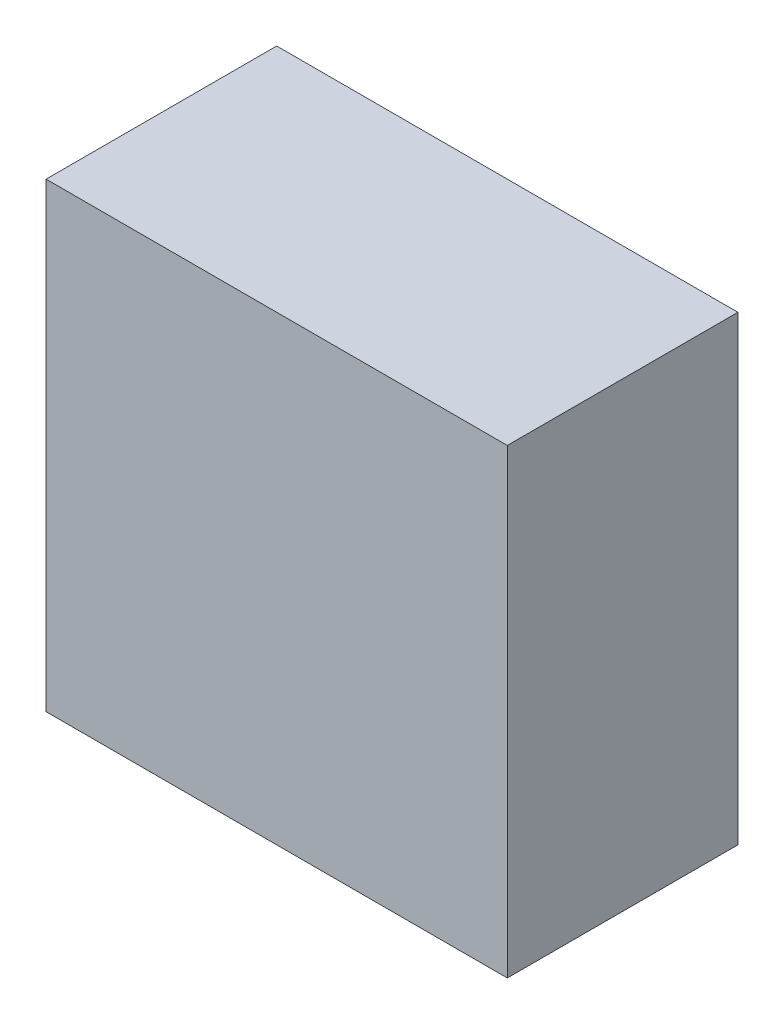
ISO-10303-21;
HEADER;
FILE_DESCRIPTION(('STEP AP214'),'2;1');
FILE_NAME('part.step','',(''),(''),'','','');
FILE_SCHEMA(('AUTOMOTIVE_DESIGN { 1 0 10303 214 1 1 1 1 }'));
ENDSEC;
DATA;
#1=APPLICATION_CONTEXT('core data for automotive mechanical design processes');
#2=APPLICATION_PROTOCOL_DEFINITION('international standard','automotive_design',2000,#1);
#3=PRODUCT_CONTEXT('',#1,'mechanical');
#4=PRODUCT('Part','Part','',(#3));
#5=PRODUCT_RELATED_PRODUCT_CATEGORY('part','',(#4));
#6=PRODUCT_DEFINITION_FORMATION('','',#4);
#7=PRODUCT_DEFINITION_CONTEXT('part definition',#1,'design');
#8=PRODUCT_DEFINITION('design','',#6,#7);
#9=PRODUCT_DEFINITION_SHAPE('','',#8);
#10=(LENGTH_UNIT() NAMED_UNIT(*) SI_UNIT(.MILLI.,.METRE.));
#11=(NAMED_UNIT(*) PLANE_ANGLE_UNIT() SI_UNIT($,.RADIAN.));
#12=(NAMED_UNIT(*) SI_UNIT($,.STERADIAN.) SOLID_ANGLE_UNIT());
#13=UNCERTAINTY_MEASURE_WITH_UNIT(LENGTH_MEASURE(1.E-05),#10,'distance_accuracy_value','');
#14=(GEOMETRIC_REPRESENTATION_CONTEXT(3) GLOBAL_UNCERTAINTY_ASSIGNED_CONTEXT((#13)) GLOBAL_UNIT_ASSIGNED_CONTEXT((#10,
#11,#12)) REPRESENTATION_CONTEXT('',''));
#15=CARTESIAN_POINT('',(0.,0.,0.));
#16=DIRECTION('',(0.,0.,1.));
#17=DIRECTION('',(1.,0.,0.));
#18=AXIS2_PLACEMENT_3D('',#15,#16,#17);
#19=CARTESIAN_POINT('',(0.,0.,100.));
#20=DIRECTION('',(-1.,0.,0.));
#21=DIRECTION('',(0.,0.,1.));
#22=AXIS2_PLACEMENT_3D('',#19,#20,#21);
#23=PLANE('',#22);
#24=DIRECTION('',(0.,1.,0.));
#25=VECTOR('',#24,1.);
#26=CARTESIAN_POINT('',(0.,0.,0.));
#27=LINE('',#26,#25);
#28=CARTESIAN_POINT('',(0.,0.,0.));
#29=VERTEX_POINT('',#28);
#30=CARTESIAN_POINT('',(0.,200.,0.));
#31=VERTEX_POINT('',#30);
#32=EDGE_CURVE('E96',#29,#31,#27,.T.);
#33=ORIENTED_EDGE('',*,*,#32,.T.);
#34=DIRECTION('',(0.,0.,-1.));
#35=VECTOR('',#34,1.);
#36=CARTESIAN_POINT('',(0.,200.,100.));
#37=LINE('',#36,#35);
#38=CARTESIAN_POINT('',(0.,200.,100.));
#39=VERTEX_POINT('',#38);
#40=EDGE_CURVE('E11',#39,#31,#37,.T.);
#41=ORIENTED_EDGE('',*,*,#40,.F.);
#42=DIRECTION('',(0.,1.,0.));
#43=VECTOR('',#42,1.);
#44=CARTESIAN_POINT('',(0.,0.,100.));
#45=LINE('',#44,#43);
#46=CARTESIAN_POINT('',(0.,0.,100.));
#47=VERTEX_POINT('',#46);
#48=EDGE_CURVE('E84',#47,#39,#45,.T.);
#49=ORIENTED_EDGE('',*,*,#48,.F.);
#50=DIRECTION('',(0.,0.,-1.));
#51=VECTOR('',#50,1.);
#52=CARTESIAN_POINT('',(0.,0.,100.));
#53=LINE('',#52,#51);
#54=EDGE_CURVE('E92',#47,#29,#53,.T.);
#55=ORIENTED_EDGE('',*,*,#54,.T.);
#56=EDGE_LOOP('',(#33,#41,#49,#55));
#57=FACE_BOUND('',#56,.T.);
#58=ADVANCED_FACE('F33',(#57),#23,.F.);
#59=CARTESIAN_POINT('',(0.,200.,100.));
#60=DIRECTION('',(0.,-1.,0.));
#61=DIRECTION('',(1.,0.,0.));
#62=AXIS2_PLACEMENT_3D('',#59,#60,#61);
#63=PLANE('',#62);
#64=DIRECTION('',(-1.,0.,0.));
#65=VECTOR('',#64,1.);
#66=CARTESIAN_POINT('',(0.,200.,0.));
#67=LINE('',#66,#65);
#68=CARTESIAN_POINT('',(-200.,200.,0.));
#69=VERTEX_POINT('',#68);
#70=EDGE_CURVE('E88',#31,#69,#67,.T.);
#71=ORIENTED_EDGE('',*,*,#70,.T.);
#72=DIRECTION('',(0.,0.,-1.));
#73=VECTOR('',#72,1.);
#74=CARTESIAN_POINT('',(-200.,200.,100.));
#75=LINE('',#74,#73);
#76=CARTESIAN_POINT('',(-200.,200.,100.));
#77=VERTEX_POINT('',#76);
#78=EDGE_CURVE('E41',#77,#69,#75,.T.);
#79=ORIENTED_EDGE('',*,*,#78,.F.);
#80=DIRECTION('',(-1.,0.,0.));
#81=VECTOR('',#80,1.);
#82=CARTESIAN_POINT('',(0.,200.,100.));
#83=LINE('',#82,#81);
#84=EDGE_CURVE('E79',#39,#77,#83,.T.);
#85=ORIENTED_EDGE('',*,*,#84,.F.);
#86=ORIENTED_EDGE('',*,*,#40,.T.);
#87=EDGE_LOOP('',(#71,#79,#85,#86));
#88=FACE_BOUND('',#87,.T.);
#89=ADVANCED_FACE('F87',(#88),#63,.F.);
#90=CARTESIAN_POINT('',(-200.,0.,100.));
#91=DIRECTION('',(1.,0.,0.));
#92=DIRECTION('',(0.,0.,-1.));
#93=AXIS2_PLACEMENT_3D('',#90,#91,#92);
#94=PLANE('',#93);
#95=DIRECTION('',(0.,-1.,0.));
#96=VECTOR('',#95,1.);
#97=CARTESIAN_POINT('',(-200.,0.,0.));
#98=LINE('',#97,#96);
#99=CARTESIAN_POINT('',(-200.,0.,0.));
#100=VERTEX_POINT('',#99);
#101=EDGE_CURVE('E66',#69,#100,#98,.T.);
#102=ORIENTED_EDGE('',*,*,#101,.T.);
#103=DIRECTION('',(0.,0.,-1.));
#104=VECTOR('',#103,1.);
#105=CARTESIAN_POINT('',(-200.,0.,100.));
#106=LINE('',#105,#104);
#107=CARTESIAN_POINT('',(-200.,0.,100.));
#108=VERTEX_POINT('',#107);
#109=EDGE_CURVE('E89',#108,#100,#106,.T.);
#110=ORIENTED_EDGE('',*,*,#109,.F.);
#111=DIRECTION('',(0.,-1.,0.));
#112=VECTOR('',#111,1.);
#113=CARTESIAN_POINT('',(-200.,0.,100.));
#114=LINE('',#113,#112);
#115=EDGE_CURVE('E82',#77,#108,#114,.T.);
#116=ORIENTED_EDGE('',*,*,#115,.F.);
#117=ORIENTED_EDGE('',*,*,#78,.T.);
#118=EDGE_LOOP('',(#102,#110,#116,#117));
#119=FACE_BOUND('',#118,.T.);
#120=ADVANCED_FACE('F90',(#119),#94,.F.);
#121=CARTESIAN_POINT('',(0.,0.,100.));
#122=DIRECTION('',(0.,1.,0.));
#123=DIRECTION('',(-1.,0.,0.));
#124=AXIS2_PLACEMENT_3D('',#121,#122,#123);
#125=PLANE('',#124);
#126=DIRECTION('',(1.,0.,0.));
#127=VECTOR('',#126,1.);
#128=CARTESIAN_POINT('',(0.,0.,0.));
#129=LINE('',#128,#127);
#130=EDGE_CURVE('E72',#100,#29,#129,.T.);
#131=ORIENTED_EDGE('',*,*,#130,.T.);
#132=ORIENTED_EDGE('',*,*,#54,.F.);
#133=DIRECTION('',(1.,0.,0.));
#134=VECTOR('',#133,1.);
#135=CARTESIAN_POINT('',(0.,0.,100.));
#136=LINE('',#135,#134);
#137=EDGE_CURVE('E49',#108,#47,#136,.T.);
#138=ORIENTED_EDGE('',*,*,#137,.F.);
#139=ORIENTED_EDGE('',*,*,#109,.T.);
#140=EDGE_LOOP('',(#131,#132,#138,#139));
#141=FACE_BOUND('',#140,.T.);
#142=ADVANCED_FACE('F103',(#141),#125,.F.);
#143=CARTESIAN_POINT('',(0.,0.,100.));
#144=DIRECTION('',(0.,0.,1.));
#145=DIRECTION('',(1.,0.,0.));
#146=AXIS2_PLACEMENT_3D('',#143,#144,#145);
#147=PLANE('',#146);
#148=ORIENTED_EDGE('',*,*,#48,.T.);
#149=ORIENTED_EDGE('',*,*,#84,.T.);
#150=ORIENTED_EDGE('',*,*,#115,.T.);
#151=ORIENTED_EDGE('',*,*,#137,.T.);
#152=EDGE_LOOP('',(#148,#149,#150,#151));
#153=FACE_BOUND('',#152,.T.);
#154=ADVANCED_FACE('F80',(#153),#147,.T.);
#155=CARTESIAN_POINT('',(0.,0.,0.));
#156=DIRECTION('',(0.,0.,1.));
#157=DIRECTION('',(1.,0.,0.));
#158=AXIS2_PLACEMENT_3D('',#155,#156,#157);
#159=PLANE('',#158);
#160=ORIENTED_EDGE('',*,*,#32,.F.);
#161=ORIENTED_EDGE('',*,*,#130,.F.);
#162=ORIENTED_EDGE('',*,*,#101,.F.);
#163=ORIENTED_EDGE('',*,*,#70,.F.);
#164=EDGE_LOOP('',(#160,#161,#162,#163));
#165=FACE_BOUND('',#164,.T.);
#166=ADVANCED_FACE('F106',(#165),#159,.F.);
#167=CLOSED_SHELL('',(#58,#89,#120,#142,#154,#166));
#168=MANIFOLD_SOLID_BREP('B2',#167);
#169=ADVANCED_BREP_SHAPE_REPRESENTATION('',(#18,#168),#14);
#170=SHAPE_DEFINITION_REPRESENTATION(#9,#169);
ENDSEC;
END-ISO-10303-21;
